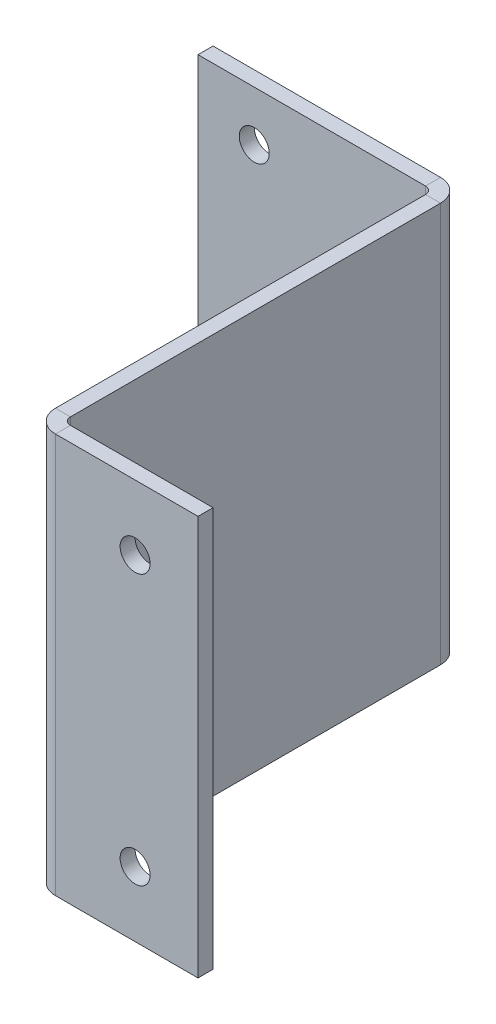
ISO-10303-21;
HEADER;
FILE_DESCRIPTION(('STEP AP214'),'2;1');
FILE_NAME('part.step','',(''),(''),'','','');
FILE_SCHEMA(('AUTOMOTIVE_DESIGN { 1 0 10303 214 1 1 1 1 }'));
ENDSEC;
DATA;
#1=APPLICATION_CONTEXT('core data for automotive mechanical design processes');
#2=APPLICATION_PROTOCOL_DEFINITION('international standard','automotive_design',2000,#1);
#3=PRODUCT_CONTEXT('',#1,'mechanical');
#4=PRODUCT('Part','Part','',(#3));
#5=PRODUCT_RELATED_PRODUCT_CATEGORY('part','',(#4));
#6=PRODUCT_DEFINITION_FORMATION('','',#4);
#7=PRODUCT_DEFINITION_CONTEXT('part definition',#1,'design');
#8=PRODUCT_DEFINITION('design','',#6,#7);
#9=PRODUCT_DEFINITION_SHAPE('','',#8);
#10=(LENGTH_UNIT() NAMED_UNIT(*) SI_UNIT(.MILLI.,.METRE.));
#11=(NAMED_UNIT(*) PLANE_ANGLE_UNIT() SI_UNIT($,.RADIAN.));
#12=(NAMED_UNIT(*) SI_UNIT($,.STERADIAN.) SOLID_ANGLE_UNIT());
#13=UNCERTAINTY_MEASURE_WITH_UNIT(LENGTH_MEASURE(1.E-05),#10,'distance_accuracy_value','');
#14=(GEOMETRIC_REPRESENTATION_CONTEXT(3) GLOBAL_UNCERTAINTY_ASSIGNED_CONTEXT((#13)) GLOBAL_UNIT_ASSIGNED_CONTEXT((#10,
#11,#12)) REPRESENTATION_CONTEXT('',''));
#15=CARTESIAN_POINT('',(0.,0.,0.));
#16=DIRECTION('',(0.,0.,1.));
#17=DIRECTION('',(1.,0.,0.));
#18=AXIS2_PLACEMENT_3D('',#15,#16,#17);
#19=CARTESIAN_POINT('',(25.,40.,2.2366));
#20=DIRECTION('',(0.,1.,0.));
#21=DIRECTION('',(0.,0.,1.));
#22=AXIS2_PLACEMENT_3D('',#19,#20,#21);
#23=PLANE('',#22);
#24=DIRECTION('',(-1.,0.,0.));
#25=VECTOR('',#24,1.);
#26=CARTESIAN_POINT('',(25.,40.,2.2366));
#27=LINE('',#26,#25);
#28=CARTESIAN_POINT('',(25.,40.,2.2366));
#29=VERTEX_POINT('',#28);
#30=CARTESIAN_POINT('',(23.5,40.,2.2366));
#31=VERTEX_POINT('',#30);
#32=EDGE_CURVE('E11',#29,#31,#27,.T.);
#33=ORIENTED_EDGE('',*,*,#32,.F.);
#34=CARTESIAN_POINT('',(22.7634,40.,2.2366));
#35=DIRECTION('',(0.,1.,0.));
#36=DIRECTION('',(0.,0.,1.));
#37=AXIS2_PLACEMENT_3D('',#34,#35,#36);
#38=CIRCLE('',#37,2.2366);
#39=CARTESIAN_POINT('',(22.7634,40.,0.));
#40=VERTEX_POINT('',#39);
#41=EDGE_CURVE('E248',#40,#29,#38,.F.);
#42=ORIENTED_EDGE('',*,*,#41,.F.);
#43=DIRECTION('',(0.,0.,-1.));
#44=VECTOR('',#43,1.);
#45=CARTESIAN_POINT('',(22.7634,40.,1.5));
#46=LINE('',#45,#44);
#47=CARTESIAN_POINT('',(22.7634,40.,1.5));
#48=VERTEX_POINT('',#47);
#49=EDGE_CURVE('E45',#48,#40,#46,.T.);
#50=ORIENTED_EDGE('',*,*,#49,.F.);
#51=CARTESIAN_POINT('',(22.7634,40.,2.2366));
#52=DIRECTION('',(0.,1.,0.));
#53=DIRECTION('',(1.,0.,0.));
#54=AXIS2_PLACEMENT_3D('',#51,#52,#53);
#55=CIRCLE('',#54,0.7366);
#56=EDGE_CURVE('E146',#48,#31,#55,.F.);
#57=ORIENTED_EDGE('',*,*,#56,.T.);
#58=EDGE_LOOP('',(#33,#42,#50,#57));
#59=FACE_BOUND('',#58,.T.);
#60=ADVANCED_FACE('F37',(#59),#23,.T.);
#61=CARTESIAN_POINT('',(22.7634,40.,1.5));
#62=DIRECTION('',(0.,1.,0.));
#63=DIRECTION('',(0.,0.,1.));
#64=AXIS2_PLACEMENT_3D('',#61,#62,#63);
#65=PLANE('',#64);
#66=DIRECTION('',(0.,0.,1.));
#67=VECTOR('',#66,1.);
#68=CARTESIAN_POINT('',(25.,40.,0.));
#69=LINE('',#68,#67);
#70=CARTESIAN_POINT('',(25.,40.,39.2634));
#71=VERTEX_POINT('',#70);
#72=EDGE_CURVE('E140',#29,#71,#69,.T.);
#73=ORIENTED_EDGE('',*,*,#72,.F.);
#74=ORIENTED_EDGE('',*,*,#32,.T.);
#75=DIRECTION('',(0.,0.,1.));
#76=VECTOR('',#75,1.);
#77=CARTESIAN_POINT('',(23.5,40.,0.));
#78=LINE('',#77,#76);
#79=CARTESIAN_POINT('',(23.5,40.,39.2634));
#80=VERTEX_POINT('',#79);
#81=EDGE_CURVE('E137',#31,#80,#78,.T.);
#82=ORIENTED_EDGE('',*,*,#81,.T.);
#83=DIRECTION('',(1.,0.,0.));
#84=VECTOR('',#83,1.);
#85=CARTESIAN_POINT('',(23.5,40.,39.2634));
#86=LINE('',#85,#84);
#87=EDGE_CURVE('E229',#80,#71,#86,.T.);
#88=ORIENTED_EDGE('',*,*,#87,.T.);
#89=EDGE_LOOP('',(#73,#74,#82,#88));
#90=FACE_BOUND('',#89,.T.);
#91=ADVANCED_FACE('F135',(#90),#65,.T.);
#92=CARTESIAN_POINT('',(22.7634,0.,0.));
#93=DIRECTION('',(0.,-1.,0.));
#94=DIRECTION('',(0.,0.,-1.));
#95=AXIS2_PLACEMENT_3D('',#92,#93,#94);
#96=PLANE('',#95);
#97=DIRECTION('',(0.,0.,1.));
#98=VECTOR('',#97,1.);
#99=CARTESIAN_POINT('',(22.7634,0.,0.));
#100=LINE('',#99,#98);
#101=CARTESIAN_POINT('',(22.7634,0.,0.));
#102=VERTEX_POINT('',#101);
#103=CARTESIAN_POINT('',(22.7634,0.,1.5));
#104=VERTEX_POINT('',#103);
#105=EDGE_CURVE('E234',#102,#104,#100,.T.);
#106=ORIENTED_EDGE('',*,*,#105,.F.);
#107=CARTESIAN_POINT('',(22.7634,0.,2.2366));
#108=DIRECTION('',(0.,1.,0.));
#109=DIRECTION('',(0.,0.,1.));
#110=AXIS2_PLACEMENT_3D('',#107,#108,#109);
#111=CIRCLE('',#110,2.2366);
#112=CARTESIAN_POINT('',(25.,0.,2.2366));
#113=VERTEX_POINT('',#112);
#114=EDGE_CURVE('E186',#102,#113,#111,.F.);
#115=ORIENTED_EDGE('',*,*,#114,.T.);
#116=DIRECTION('',(1.,0.,0.));
#117=VECTOR('',#116,1.);
#118=CARTESIAN_POINT('',(23.5,0.,2.2366));
#119=LINE('',#118,#117);
#120=CARTESIAN_POINT('',(23.5,0.,2.2366));
#121=VERTEX_POINT('',#120);
#122=EDGE_CURVE('E232',#121,#113,#119,.T.);
#123=ORIENTED_EDGE('',*,*,#122,.F.);
#124=CARTESIAN_POINT('',(22.7634,0.,2.2366));
#125=DIRECTION('',(0.,1.,0.));
#126=DIRECTION('',(1.,0.,0.));
#127=AXIS2_PLACEMENT_3D('',#124,#125,#126);
#128=CIRCLE('',#127,0.7366);
#129=EDGE_CURVE('E158',#104,#121,#128,.F.);
#130=ORIENTED_EDGE('',*,*,#129,.F.);
#131=EDGE_LOOP('',(#106,#115,#123,#130));
#132=FACE_BOUND('',#131,.T.);
#133=ADVANCED_FACE('F328',(#132),#96,.T.);
#134=CARTESIAN_POINT('',(23.5,0.,2.2366));
#135=DIRECTION('',(0.,-1.,0.));
#136=DIRECTION('',(0.,0.,-1.));
#137=AXIS2_PLACEMENT_3D('',#134,#135,#136);
#138=PLANE('',#137);
#139=DIRECTION('',(1.,0.,0.));
#140=VECTOR('',#139,1.);
#141=CARTESIAN_POINT('',(0.,0.,0.));
#142=LINE('',#141,#140);
#143=CARTESIAN_POINT('',(0.,0.,0.));
#144=VERTEX_POINT('',#143);
#145=EDGE_CURVE('E189',#144,#102,#142,.T.);
#146=ORIENTED_EDGE('',*,*,#145,.T.);
#147=ORIENTED_EDGE('',*,*,#105,.T.);
#148=DIRECTION('',(1.,0.,0.));
#149=VECTOR('',#148,1.);
#150=CARTESIAN_POINT('',(0.,0.,1.5));
#151=LINE('',#150,#149);
#152=CARTESIAN_POINT('',(0.,0.,1.5));
#153=VERTEX_POINT('',#152);
#154=EDGE_CURVE('E195',#153,#104,#151,.T.);
#155=ORIENTED_EDGE('',*,*,#154,.F.);
#156=DIRECTION('',(0.,0.,-1.));
#157=VECTOR('',#156,1.);
#158=CARTESIAN_POINT('',(0.,0.,1.5));
#159=LINE('',#158,#157);
#160=EDGE_CURVE('E192',#153,#144,#159,.T.);
#161=ORIENTED_EDGE('',*,*,#160,.T.);
#162=EDGE_LOOP('',(#146,#147,#155,#161));
#163=FACE_BOUND('',#162,.T.);
#164=ADVANCED_FACE('F332',(#163),#138,.T.);
#165=CARTESIAN_POINT('',(25.7366,40.,40.));
#166=DIRECTION('',(0.,1.,0.));
#167=DIRECTION('',(0.,0.,1.));
#168=AXIS2_PLACEMENT_3D('',#165,#166,#167);
#169=PLANE('',#168);
#170=DIRECTION('',(0.,0.,1.));
#171=VECTOR('',#170,1.);
#172=CARTESIAN_POINT('',(25.7366,40.,40.));
#173=LINE('',#172,#171);
#174=CARTESIAN_POINT('',(25.7366,40.,40.));
#175=VERTEX_POINT('',#174);
#176=CARTESIAN_POINT('',(25.7366,40.,41.5));
#177=VERTEX_POINT('',#176);
#178=EDGE_CURVE('E53',#175,#177,#173,.T.);
#179=ORIENTED_EDGE('',*,*,#178,.F.);
#180=CARTESIAN_POINT('',(25.7366,40.,39.2634));
#181=DIRECTION('',(0.,-1.,0.));
#182=DIRECTION('',(0.,0.,-1.));
#183=AXIS2_PLACEMENT_3D('',#180,#181,#182);
#184=CIRCLE('',#183,0.7366);
#185=EDGE_CURVE('E258',#71,#175,#184,.F.);
#186=ORIENTED_EDGE('',*,*,#185,.F.);
#187=ORIENTED_EDGE('',*,*,#87,.F.);
#188=CARTESIAN_POINT('',(25.7366,40.,39.2634));
#189=DIRECTION('',(0.,1.,0.));
#190=DIRECTION('',(1.,0.,0.));
#191=AXIS2_PLACEMENT_3D('',#188,#189,#190);
#192=CIRCLE('',#191,2.2366);
#193=EDGE_CURVE('E166',#80,#177,#192,.T.);
#194=ORIENTED_EDGE('',*,*,#193,.T.);
#195=EDGE_LOOP('',(#179,#186,#187,#194));
#196=FACE_BOUND('',#195,.T.);
#197=ADVANCED_FACE('F338',(#196),#169,.T.);
#198=CARTESIAN_POINT('',(23.5,40.,39.2634));
#199=DIRECTION('',(0.,1.,0.));
#200=DIRECTION('',(0.,0.,1.));
#201=AXIS2_PLACEMENT_3D('',#198,#199,#200);
#202=PLANE('',#201);
#203=DIRECTION('',(1.,0.,0.));
#204=VECTOR('',#203,1.);
#205=CARTESIAN_POINT('',(25.,40.,40.));
#206=LINE('',#205,#204);
#207=CARTESIAN_POINT('',(40.,40.,40.));
#208=VERTEX_POINT('',#207);
#209=EDGE_CURVE('E261',#175,#208,#206,.T.);
#210=ORIENTED_EDGE('',*,*,#209,.F.);
#211=ORIENTED_EDGE('',*,*,#178,.T.);
#212=DIRECTION('',(1.,0.,0.));
#213=VECTOR('',#212,1.);
#214=CARTESIAN_POINT('',(25.,40.,41.5));
#215=LINE('',#214,#213);
#216=CARTESIAN_POINT('',(40.,40.,41.5));
#217=VERTEX_POINT('',#216);
#218=EDGE_CURVE('E107',#177,#217,#215,.T.);
#219=ORIENTED_EDGE('',*,*,#218,.T.);
#220=DIRECTION('',(0.,0.,1.));
#221=VECTOR('',#220,1.);
#222=CARTESIAN_POINT('',(40.,40.,40.));
#223=LINE('',#222,#221);
#224=EDGE_CURVE('E264',#208,#217,#223,.T.);
#225=ORIENTED_EDGE('',*,*,#224,.F.);
#226=EDGE_LOOP('',(#210,#211,#219,#225));
#227=FACE_BOUND('',#226,.T.);
#228=ADVANCED_FACE('F342',(#227),#202,.T.);
#229=CARTESIAN_POINT('',(25.,0.,39.2634));
#230=DIRECTION('',(0.,-1.,0.));
#231=DIRECTION('',(0.,0.,-1.));
#232=AXIS2_PLACEMENT_3D('',#229,#230,#231);
#233=PLANE('',#232);
#234=DIRECTION('',(-1.,0.,0.));
#235=VECTOR('',#234,1.);
#236=CARTESIAN_POINT('',(25.,0.,39.2634));
#237=LINE('',#236,#235);
#238=CARTESIAN_POINT('',(25.,0.,39.2634));
#239=VERTEX_POINT('',#238);
#240=CARTESIAN_POINT('',(23.5,0.,39.2634));
#241=VERTEX_POINT('',#240);
#242=EDGE_CURVE('E94',#239,#241,#237,.T.);
#243=ORIENTED_EDGE('',*,*,#242,.F.);
#244=CARTESIAN_POINT('',(25.7366,0.,39.2634));
#245=DIRECTION('',(0.,-1.,0.));
#246=DIRECTION('',(0.,0.,-1.));
#247=AXIS2_PLACEMENT_3D('',#244,#245,#246);
#248=CIRCLE('',#247,0.7366);
#249=CARTESIAN_POINT('',(25.7366,0.,40.));
#250=VERTEX_POINT('',#249);
#251=EDGE_CURVE('E182',#239,#250,#248,.F.);
#252=ORIENTED_EDGE('',*,*,#251,.T.);
#253=DIRECTION('',(0.,0.,-1.));
#254=VECTOR('',#253,1.);
#255=CARTESIAN_POINT('',(25.7366,0.,41.5));
#256=LINE('',#255,#254);
#257=CARTESIAN_POINT('',(25.7366,0.,41.5));
#258=VERTEX_POINT('',#257);
#259=EDGE_CURVE('E101',#258,#250,#256,.T.);
#260=ORIENTED_EDGE('',*,*,#259,.F.);
#261=CARTESIAN_POINT('',(25.7366,0.,39.2634));
#262=DIRECTION('',(0.,1.,0.));
#263=DIRECTION('',(1.,0.,0.));
#264=AXIS2_PLACEMENT_3D('',#261,#262,#263);
#265=CIRCLE('',#264,2.2366);
#266=EDGE_CURVE('E201',#241,#258,#265,.T.);
#267=ORIENTED_EDGE('',*,*,#266,.F.);
#268=EDGE_LOOP('',(#243,#252,#260,#267));
#269=FACE_BOUND('',#268,.T.);
#270=ADVANCED_FACE('F346',(#269),#233,.T.);
#271=CARTESIAN_POINT('',(25.7366,0.,41.5));
#272=DIRECTION('',(0.,-1.,0.));
#273=DIRECTION('',(0.,0.,-1.));
#274=AXIS2_PLACEMENT_3D('',#271,#272,#273);
#275=PLANE('',#274);
#276=DIRECTION('',(0.,0.,1.));
#277=VECTOR('',#276,1.);
#278=CARTESIAN_POINT('',(25.,0.,0.));
#279=LINE('',#278,#277);
#280=EDGE_CURVE('E184',#113,#239,#279,.T.);
#281=ORIENTED_EDGE('',*,*,#280,.T.);
#282=ORIENTED_EDGE('',*,*,#242,.T.);
#283=DIRECTION('',(0.,0.,1.));
#284=VECTOR('',#283,1.);
#285=CARTESIAN_POINT('',(23.5,0.,0.));
#286=LINE('',#285,#284);
#287=EDGE_CURVE('E199',#121,#241,#286,.T.);
#288=ORIENTED_EDGE('',*,*,#287,.F.);
#289=ORIENTED_EDGE('',*,*,#122,.T.);
#290=EDGE_LOOP('',(#281,#282,#288,#289));
#291=FACE_BOUND('',#290,.T.);
#292=ADVANCED_FACE('F349',(#291),#275,.T.);
#293=CARTESIAN_POINT('',(25.,40.,41.5));
#294=DIRECTION('',(0.,0.,-1.));
#295=DIRECTION('',(-1.,0.,0.));
#296=AXIS2_PLACEMENT_3D('',#293,#294,#295);
#297=PLANE('',#296);
#298=CARTESIAN_POINT('',(33.7057529278582,33.5,41.5));
#299=DIRECTION('',(0.,0.,-1.));
#300=DIRECTION('',(-1.,0.,0.));
#301=AXIS2_PLACEMENT_3D('',#298,#299,#300);
#302=CIRCLE('',#301,1.49999999999999);
#303=CARTESIAN_POINT('',(32.2057529278582,33.5,41.5));
#304=VERTEX_POINT('',#303);
#305=EDGE_CURVE('E273',#304,#304,#302,.T.);
#306=ORIENTED_EDGE('',*,*,#305,.T.);
#307=EDGE_LOOP('',(#306));
#308=FACE_BOUND('',#307,.T.);
#309=CARTESIAN_POINT('',(33.7057529278581,6.5,41.5));
#310=DIRECTION('',(0.,0.,-1.));
#311=DIRECTION('',(-1.,0.,0.));
#312=AXIS2_PLACEMENT_3D('',#309,#310,#311);
#313=CIRCLE('',#312,1.49999999999999);
#314=CARTESIAN_POINT('',(32.2057529278581,6.5,41.5));
#315=VERTEX_POINT('',#314);
#316=EDGE_CURVE('E176',#315,#315,#313,.T.);
#317=ORIENTED_EDGE('',*,*,#316,.T.);
#318=EDGE_LOOP('',(#317));
#319=FACE_BOUND('',#318,.T.);
#320=DIRECTION('',(1.,0.,0.));
#321=VECTOR('',#320,1.);
#322=CARTESIAN_POINT('',(25.,0.,41.5));
#323=LINE('',#322,#321);
#324=CARTESIAN_POINT('',(40.,0.,41.5));
#325=VERTEX_POINT('',#324);
#326=EDGE_CURVE('E172',#258,#325,#323,.T.);
#327=ORIENTED_EDGE('',*,*,#326,.T.);
#328=DIRECTION('',(0.,-1.,0.));
#329=VECTOR('',#328,1.);
#330=CARTESIAN_POINT('',(40.,40.,41.5));
#331=LINE('',#330,#329);
#332=EDGE_CURVE('E225',#217,#325,#331,.T.);
#333=ORIENTED_EDGE('',*,*,#332,.F.);
#334=ORIENTED_EDGE('',*,*,#218,.F.);
#335=DIRECTION('',(0.,-1.,0.));
#336=VECTOR('',#335,1.);
#337=CARTESIAN_POINT('',(25.7366,40.,41.5));
#338=LINE('',#337,#336);
#339=EDGE_CURVE('E168',#177,#258,#338,.T.);
#340=ORIENTED_EDGE('',*,*,#339,.T.);
#341=EDGE_LOOP('',(#327,#333,#334,#340));
#342=FACE_BOUND('',#341,.T.);
#343=ADVANCED_FACE('F352',(#308,#319,#342),#297,.F.);
#344=CARTESIAN_POINT('',(40.,40.,40.));
#345=DIRECTION('',(1.,0.,0.));
#346=DIRECTION('',(0.,0.,-1.));
#347=AXIS2_PLACEMENT_3D('',#344,#345,#346);
#348=PLANE('',#347);
#349=DIRECTION('',(0.,0.,1.));
#350=VECTOR('',#349,1.);
#351=CARTESIAN_POINT('',(40.,0.,40.));
#352=LINE('',#351,#350);
#353=CARTESIAN_POINT('',(40.,0.,40.));
#354=VERTEX_POINT('',#353);
#355=EDGE_CURVE('E175',#354,#325,#352,.T.);
#356=ORIENTED_EDGE('',*,*,#355,.F.);
#357=DIRECTION('',(0.,-1.,0.));
#358=VECTOR('',#357,1.);
#359=CARTESIAN_POINT('',(40.,40.,40.));
#360=LINE('',#359,#358);
#361=EDGE_CURVE('E223',#208,#354,#360,.T.);
#362=ORIENTED_EDGE('',*,*,#361,.F.);
#363=ORIENTED_EDGE('',*,*,#224,.T.);
#364=ORIENTED_EDGE('',*,*,#332,.T.);
#365=EDGE_LOOP('',(#356,#362,#363,#364));
#366=FACE_BOUND('',#365,.T.);
#367=ADVANCED_FACE('F355',(#366),#348,.T.);
#368=CARTESIAN_POINT('',(25.,40.,40.));
#369=DIRECTION('',(0.,0.,-1.));
#370=DIRECTION('',(-1.,0.,0.));
#371=AXIS2_PLACEMENT_3D('',#368,#369,#370);
#372=PLANE('',#371);
#373=CARTESIAN_POINT('',(33.7057529278582,33.5,40.));
#374=DIRECTION('',(0.,0.,-1.));
#375=DIRECTION('',(-1.,0.,0.));
#376=AXIS2_PLACEMENT_3D('',#373,#374,#375);
#377=CIRCLE('',#376,1.49999999999999);
#378=CARTESIAN_POINT('',(32.2057529278582,33.5,40.));
#379=VERTEX_POINT('',#378);
#380=EDGE_CURVE('E276',#379,#379,#377,.T.);
#381=ORIENTED_EDGE('',*,*,#380,.F.);
#382=EDGE_LOOP('',(#381));
#383=FACE_BOUND('',#382,.T.);
#384=CARTESIAN_POINT('',(33.7057529278581,6.5,40.));
#385=DIRECTION('',(0.,0.,-1.));
#386=DIRECTION('',(-1.,0.,0.));
#387=AXIS2_PLACEMENT_3D('',#384,#385,#386);
#388=CIRCLE('',#387,1.49999999999999);
#389=CARTESIAN_POINT('',(32.2057529278582,6.5,40.));
#390=VERTEX_POINT('',#389);
#391=EDGE_CURVE('E270',#390,#390,#388,.T.);
#392=ORIENTED_EDGE('',*,*,#391,.F.);
#393=EDGE_LOOP('',(#392));
#394=FACE_BOUND('',#393,.T.);
#395=DIRECTION('',(1.,0.,0.));
#396=VECTOR('',#395,1.);
#397=CARTESIAN_POINT('',(25.,0.,40.));
#398=LINE('',#397,#396);
#399=EDGE_CURVE('E179',#250,#354,#398,.T.);
#400=ORIENTED_EDGE('',*,*,#399,.F.);
#401=DIRECTION('',(0.,-1.,0.));
#402=VECTOR('',#401,1.);
#403=CARTESIAN_POINT('',(25.7366,40.,40.));
#404=LINE('',#403,#402);
#405=EDGE_CURVE('E220',#175,#250,#404,.T.);
#406=ORIENTED_EDGE('',*,*,#405,.F.);
#407=ORIENTED_EDGE('',*,*,#209,.T.);
#408=ORIENTED_EDGE('',*,*,#361,.T.);
#409=EDGE_LOOP('',(#400,#406,#407,#408));
#410=FACE_BOUND('',#409,.T.);
#411=ADVANCED_FACE('F359',(#383,#394,#410),#372,.T.);
#412=CARTESIAN_POINT('',(25.7366,40.,39.2634));
#413=DIRECTION('',(0.,-1.,0.));
#414=DIRECTION('',(0.,0.,-1.));
#415=AXIS2_PLACEMENT_3D('',#412,#413,#414);
#416=CYLINDRICAL_SURFACE('',#415,0.7366);
#417=ORIENTED_EDGE('',*,*,#251,.F.);
#418=DIRECTION('',(0.,-1.,0.));
#419=VECTOR('',#418,1.);
#420=CARTESIAN_POINT('',(25.,40.,39.2634));
#421=LINE('',#420,#419);
#422=EDGE_CURVE('E217',#71,#239,#421,.T.);
#423=ORIENTED_EDGE('',*,*,#422,.F.);
#424=ORIENTED_EDGE('',*,*,#185,.T.);
#425=ORIENTED_EDGE('',*,*,#405,.T.);
#426=EDGE_LOOP('',(#417,#423,#424,#425));
#427=FACE_BOUND('',#426,.T.);
#428=ADVANCED_FACE('F363',(#427),#416,.F.);
#429=CARTESIAN_POINT('',(25.,40.,0.));
#430=DIRECTION('',(1.,0.,0.));
#431=DIRECTION('',(0.,0.,-1.));
#432=AXIS2_PLACEMENT_3D('',#429,#430,#431);
#433=PLANE('',#432);
#434=ORIENTED_EDGE('',*,*,#280,.F.);
#435=DIRECTION('',(0.,-1.,0.));
#436=VECTOR('',#435,1.);
#437=CARTESIAN_POINT('',(25.,40.,2.2366));
#438=LINE('',#437,#436);
#439=EDGE_CURVE('E214',#29,#113,#438,.T.);
#440=ORIENTED_EDGE('',*,*,#439,.F.);
#441=ORIENTED_EDGE('',*,*,#72,.T.);
#442=ORIENTED_EDGE('',*,*,#422,.T.);
#443=EDGE_LOOP('',(#434,#440,#441,#442));
#444=FACE_BOUND('',#443,.T.);
#445=ADVANCED_FACE('F367',(#444),#433,.T.);
#446=CARTESIAN_POINT('',(22.7634,40.,2.2366));
#447=DIRECTION('',(0.,-1.,0.));
#448=DIRECTION('',(0.,0.,-1.));
#449=AXIS2_PLACEMENT_3D('',#446,#447,#448);
#450=CYLINDRICAL_SURFACE('',#449,2.2366);
#451=ORIENTED_EDGE('',*,*,#114,.F.);
#452=DIRECTION('',(0.,-1.,0.));
#453=VECTOR('',#452,1.);
#454=CARTESIAN_POINT('',(22.7634,40.,0.));
#455=LINE('',#454,#453);
#456=EDGE_CURVE('E211',#40,#102,#455,.T.);
#457=ORIENTED_EDGE('',*,*,#456,.F.);
#458=ORIENTED_EDGE('',*,*,#41,.T.);
#459=ORIENTED_EDGE('',*,*,#439,.T.);
#460=EDGE_LOOP('',(#451,#457,#458,#459));
#461=FACE_BOUND('',#460,.T.);
#462=ADVANCED_FACE('F247',(#461),#450,.T.);
#463=CARTESIAN_POINT('',(0.,40.,0.));
#464=DIRECTION('',(0.,0.,-1.));
#465=DIRECTION('',(-1.,0.,0.));
#466=AXIS2_PLACEMENT_3D('',#463,#464,#465);
#467=PLANE('',#466);
#468=CARTESIAN_POINT('',(5.62673328570007,35.,0.));
#469=DIRECTION('',(0.,0.,-1.));
#470=DIRECTION('',(-1.,0.,0.));
#471=AXIS2_PLACEMENT_3D('',#468,#469,#470);
#472=CIRCLE('',#471,1.49999999999999);
#473=CARTESIAN_POINT('',(4.12673328570008,35.,0.));
#474=VERTEX_POINT('',#473);
#475=EDGE_CURVE('E294',#474,#474,#472,.T.);
#476=ORIENTED_EDGE('',*,*,#475,.F.);
#477=EDGE_LOOP('',(#476));
#478=FACE_BOUND('',#477,.T.);
#479=CARTESIAN_POINT('',(5.62673328570007,5.,0.));
#480=DIRECTION('',(0.,0.,-1.));
#481=DIRECTION('',(-1.,0.,0.));
#482=AXIS2_PLACEMENT_3D('',#479,#480,#481);
#483=CIRCLE('',#482,1.49999999999999);
#484=CARTESIAN_POINT('',(4.12673328570008,5.,0.));
#485=VERTEX_POINT('',#484);
#486=EDGE_CURVE('E288',#485,#485,#483,.T.);
#487=ORIENTED_EDGE('',*,*,#486,.F.);
#488=EDGE_LOOP('',(#487));
#489=FACE_BOUND('',#488,.T.);
#490=CARTESIAN_POINT('',(5.62673328570007,20.,0.));
#491=DIRECTION('',(0.,0.,-1.));
#492=DIRECTION('',(-1.,0.,0.));
#493=AXIS2_PLACEMENT_3D('',#490,#491,#492);
#494=CIRCLE('',#493,1.49999999999999);
#495=CARTESIAN_POINT('',(4.12673328570008,20.,0.));
#496=VERTEX_POINT('',#495);
#497=EDGE_CURVE('E282',#496,#496,#494,.T.);
#498=ORIENTED_EDGE('',*,*,#497,.F.);
#499=EDGE_LOOP('',(#498));
#500=FACE_BOUND('',#499,.T.);
#501=ORIENTED_EDGE('',*,*,#145,.F.);
#502=DIRECTION('',(0.,-1.,0.));
#503=VECTOR('',#502,1.);
#504=CARTESIAN_POINT('',(0.,40.,0.));
#505=LINE('',#504,#503);
#506=CARTESIAN_POINT('',(0.,40.,0.));
#507=VERTEX_POINT('',#506);
#508=EDGE_CURVE('E209',#507,#144,#505,.T.);
#509=ORIENTED_EDGE('',*,*,#508,.F.);
#510=DIRECTION('',(1.,0.,0.));
#511=VECTOR('',#510,1.);
#512=CARTESIAN_POINT('',(0.,40.,0.));
#513=LINE('',#512,#511);
#514=EDGE_CURVE('E241',#507,#40,#513,.T.);
#515=ORIENTED_EDGE('',*,*,#514,.T.);
#516=ORIENTED_EDGE('',*,*,#456,.T.);
#517=EDGE_LOOP('',(#501,#509,#515,#516));
#518=FACE_BOUND('',#517,.T.);
#519=ADVANCED_FACE('F252',(#478,#489,#500,#518),#467,.T.);
#520=CARTESIAN_POINT('',(0.,40.,1.5));
#521=DIRECTION('',(-1.,0.,0.));
#522=DIRECTION('',(0.,0.,1.));
#523=AXIS2_PLACEMENT_3D('',#520,#521,#522);
#524=PLANE('',#523);
#525=ORIENTED_EDGE('',*,*,#160,.F.);
#526=DIRECTION('',(0.,-1.,0.));
#527=VECTOR('',#526,1.);
#528=CARTESIAN_POINT('',(0.,40.,1.5));
#529=LINE('',#528,#527);
#530=CARTESIAN_POINT('',(0.,40.,1.5));
#531=VERTEX_POINT('',#530);
#532=EDGE_CURVE('E207',#531,#153,#529,.T.);
#533=ORIENTED_EDGE('',*,*,#532,.F.);
#534=DIRECTION('',(0.,0.,-1.));
#535=VECTOR('',#534,1.);
#536=CARTESIAN_POINT('',(0.,40.,1.5));
#537=LINE('',#536,#535);
#538=EDGE_CURVE('E253',#531,#507,#537,.T.);
#539=ORIENTED_EDGE('',*,*,#538,.T.);
#540=ORIENTED_EDGE('',*,*,#508,.T.);
#541=EDGE_LOOP('',(#525,#533,#539,#540));
#542=FACE_BOUND('',#541,.T.);
#543=ADVANCED_FACE('F302',(#542),#524,.T.);
#544=CARTESIAN_POINT('',(0.,40.,1.5));
#545=DIRECTION('',(0.,0.,-1.));
#546=DIRECTION('',(-1.,0.,0.));
#547=AXIS2_PLACEMENT_3D('',#544,#545,#546);
#548=PLANE('',#547);
#549=CARTESIAN_POINT('',(5.62673328570007,35.,1.5));
#550=DIRECTION('',(0.,0.,-1.));
#551=DIRECTION('',(-1.,0.,0.));
#552=AXIS2_PLACEMENT_3D('',#549,#550,#551);
#553=CIRCLE('',#552,1.49999999999999);
#554=CARTESIAN_POINT('',(4.12673328570008,35.,1.5));
#555=VERTEX_POINT('',#554);
#556=EDGE_CURVE('E291',#555,#555,#553,.T.);
#557=ORIENTED_EDGE('',*,*,#556,.T.);
#558=EDGE_LOOP('',(#557));
#559=FACE_BOUND('',#558,.T.);
#560=CARTESIAN_POINT('',(5.62673328570007,5.,1.5));
#561=DIRECTION('',(0.,0.,-1.));
#562=DIRECTION('',(-1.,0.,0.));
#563=AXIS2_PLACEMENT_3D('',#560,#561,#562);
#564=CIRCLE('',#563,1.49999999999999);
#565=CARTESIAN_POINT('',(4.12673328570008,5.,1.5));
#566=VERTEX_POINT('',#565);
#567=EDGE_CURVE('E285',#566,#566,#564,.T.);
#568=ORIENTED_EDGE('',*,*,#567,.T.);
#569=EDGE_LOOP('',(#568));
#570=FACE_BOUND('',#569,.T.);
#571=CARTESIAN_POINT('',(5.62673328570007,20.,1.5));
#572=DIRECTION('',(0.,0.,-1.));
#573=DIRECTION('',(-1.,0.,0.));
#574=AXIS2_PLACEMENT_3D('',#571,#572,#573);
#575=CIRCLE('',#574,1.49999999999999);
#576=CARTESIAN_POINT('',(4.12673328570008,20.,1.5));
#577=VERTEX_POINT('',#576);
#578=EDGE_CURVE('E279',#577,#577,#575,.T.);
#579=ORIENTED_EDGE('',*,*,#578,.T.);
#580=EDGE_LOOP('',(#579));
#581=FACE_BOUND('',#580,.T.);
#582=ORIENTED_EDGE('',*,*,#154,.T.);
#583=DIRECTION('',(0.,-1.,0.));
#584=VECTOR('',#583,1.);
#585=CARTESIAN_POINT('',(22.7634,40.,1.5));
#586=LINE('',#585,#584);
#587=EDGE_CURVE('E160',#48,#104,#586,.T.);
#588=ORIENTED_EDGE('',*,*,#587,.F.);
#589=DIRECTION('',(1.,0.,0.));
#590=VECTOR('',#589,1.);
#591=CARTESIAN_POINT('',(0.,40.,1.5));
#592=LINE('',#591,#590);
#593=EDGE_CURVE('E151',#531,#48,#592,.T.);
#594=ORIENTED_EDGE('',*,*,#593,.F.);
#595=ORIENTED_EDGE('',*,*,#532,.T.);
#596=EDGE_LOOP('',(#582,#588,#594,#595));
#597=FACE_BOUND('',#596,.T.);
#598=ADVANCED_FACE('F376',(#559,#570,#581,#597),#548,.F.);
#599=CARTESIAN_POINT('',(22.7634,40.,2.2366));
#600=DIRECTION('',(0.,-1.,0.));
#601=DIRECTION('',(0.,0.,-1.));
#602=AXIS2_PLACEMENT_3D('',#599,#600,#601);
#603=CYLINDRICAL_SURFACE('',#602,0.7366);
#604=ORIENTED_EDGE('',*,*,#129,.T.);
#605=DIRECTION('',(0.,-1.,0.));
#606=VECTOR('',#605,1.);
#607=CARTESIAN_POINT('',(23.5,40.,2.2366));
#608=LINE('',#607,#606);
#609=EDGE_CURVE('E155',#31,#121,#608,.T.);
#610=ORIENTED_EDGE('',*,*,#609,.F.);
#611=ORIENTED_EDGE('',*,*,#56,.F.);
#612=ORIENTED_EDGE('',*,*,#587,.T.);
#613=EDGE_LOOP('',(#604,#610,#611,#612));
#614=FACE_BOUND('',#613,.T.);
#615=ADVANCED_FACE('F156',(#614),#603,.F.);
#616=CARTESIAN_POINT('',(23.5,40.,0.));
#617=DIRECTION('',(1.,0.,0.));
#618=DIRECTION('',(0.,0.,-1.));
#619=AXIS2_PLACEMENT_3D('',#616,#617,#618);
#620=PLANE('',#619);
#621=ORIENTED_EDGE('',*,*,#287,.T.);
#622=DIRECTION('',(0.,-1.,0.));
#623=VECTOR('',#622,1.);
#624=CARTESIAN_POINT('',(23.5,40.,39.2634));
#625=LINE('',#624,#623);
#626=EDGE_CURVE('E161',#80,#241,#625,.T.);
#627=ORIENTED_EDGE('',*,*,#626,.F.);
#628=ORIENTED_EDGE('',*,*,#81,.F.);
#629=ORIENTED_EDGE('',*,*,#609,.T.);
#630=EDGE_LOOP('',(#621,#627,#628,#629));
#631=FACE_BOUND('',#630,.T.);
#632=ADVANCED_FACE('F163',(#631),#620,.F.);
#633=CARTESIAN_POINT('',(25.7366,40.,39.2634));
#634=DIRECTION('',(0.,-1.,0.));
#635=DIRECTION('',(0.,0.,-1.));
#636=AXIS2_PLACEMENT_3D('',#633,#634,#635);
#637=CYLINDRICAL_SURFACE('',#636,2.2366);
#638=ORIENTED_EDGE('',*,*,#266,.T.);
#639=ORIENTED_EDGE('',*,*,#339,.F.);
#640=ORIENTED_EDGE('',*,*,#193,.F.);
#641=ORIENTED_EDGE('',*,*,#626,.T.);
#642=EDGE_LOOP('',(#638,#639,#640,#641));
#643=FACE_BOUND('',#642,.T.);
#644=ADVANCED_FACE('F385',(#643),#637,.T.);
#645=CARTESIAN_POINT('',(25.7366,40.,39.2634));
#646=DIRECTION('',(0.,-1.,0.));
#647=DIRECTION('',(-1.,0.,0.));
#648=AXIS2_PLACEMENT_3D('',#645,#646,#647);
#649=PLANE('',#648);
#650=ORIENTED_EDGE('',*,*,#593,.T.);
#651=ORIENTED_EDGE('',*,*,#49,.T.);
#652=ORIENTED_EDGE('',*,*,#514,.F.);
#653=ORIENTED_EDGE('',*,*,#538,.F.);
#654=EDGE_LOOP('',(#650,#651,#652,#653));
#655=FACE_BOUND('',#654,.T.);
#656=ADVANCED_FACE('F238',(#655),#649,.F.);
#657=CARTESIAN_POINT('',(25.7366,0.,39.2634));
#658=DIRECTION('',(0.,-1.,0.));
#659=DIRECTION('',(-1.,0.,0.));
#660=AXIS2_PLACEMENT_3D('',#657,#658,#659);
#661=PLANE('',#660);
#662=ORIENTED_EDGE('',*,*,#326,.F.);
#663=ORIENTED_EDGE('',*,*,#259,.T.);
#664=ORIENTED_EDGE('',*,*,#399,.T.);
#665=ORIENTED_EDGE('',*,*,#355,.T.);
#666=EDGE_LOOP('',(#662,#663,#664,#665));
#667=FACE_BOUND('',#666,.T.);
#668=ADVANCED_FACE('F389',(#667),#661,.T.);
#669=CARTESIAN_POINT('',(33.7057529278581,6.5,40.));
#670=DIRECTION('',(0.,0.,-1.));
#671=DIRECTION('',(-1.,0.,0.));
#672=AXIS2_PLACEMENT_3D('',#669,#670,#671);
#673=CYLINDRICAL_SURFACE('',#672,1.49999999999999);
#674=ORIENTED_EDGE('',*,*,#316,.F.);
#675=EDGE_LOOP('',(#674));
#676=FACE_BOUND('',#675,.T.);
#677=ORIENTED_EDGE('',*,*,#391,.T.);
#678=EDGE_LOOP('',(#677));
#679=FACE_BOUND('',#678,.T.);
#680=ADVANCED_FACE('F320',(#676,#679),#673,.F.);
#681=CARTESIAN_POINT('',(33.7057529278582,33.5,40.));
#682=DIRECTION('',(0.,0.,-1.));
#683=DIRECTION('',(-1.,0.,0.));
#684=AXIS2_PLACEMENT_3D('',#681,#682,#683);
#685=CYLINDRICAL_SURFACE('',#684,1.49999999999999);
#686=ORIENTED_EDGE('',*,*,#305,.F.);
#687=EDGE_LOOP('',(#686));
#688=FACE_BOUND('',#687,.T.);
#689=ORIENTED_EDGE('',*,*,#380,.T.);
#690=EDGE_LOOP('',(#689));
#691=FACE_BOUND('',#690,.T.);
#692=ADVANCED_FACE('F311',(#688,#691),#685,.F.);
#693=CARTESIAN_POINT('',(5.62673328570007,20.,0.));
#694=DIRECTION('',(0.,0.,-1.));
#695=DIRECTION('',(-1.,0.,0.));
#696=AXIS2_PLACEMENT_3D('',#693,#694,#695);
#697=CYLINDRICAL_SURFACE('',#696,1.49999999999999);
#698=ORIENTED_EDGE('',*,*,#578,.F.);
#699=EDGE_LOOP('',(#698));
#700=FACE_BOUND('',#699,.T.);
#701=ORIENTED_EDGE('',*,*,#497,.T.);
#702=EDGE_LOOP('',(#701));
#703=FACE_BOUND('',#702,.T.);
#704=ADVANCED_FACE('F308',(#700,#703),#697,.F.);
#705=CARTESIAN_POINT('',(5.62673328570007,5.,0.));
#706=DIRECTION('',(0.,0.,-1.));
#707=DIRECTION('',(-1.,0.,0.));
#708=AXIS2_PLACEMENT_3D('',#705,#706,#707);
#709=CYLINDRICAL_SURFACE('',#708,1.49999999999999);
#710=ORIENTED_EDGE('',*,*,#567,.F.);
#711=EDGE_LOOP('',(#710));
#712=FACE_BOUND('',#711,.T.);
#713=ORIENTED_EDGE('',*,*,#486,.T.);
#714=EDGE_LOOP('',(#713));
#715=FACE_BOUND('',#714,.T.);
#716=ADVANCED_FACE('F310',(#712,#715),#709,.F.);
#717=CARTESIAN_POINT('',(5.62673328570007,35.,0.));
#718=DIRECTION('',(0.,0.,-1.));
#719=DIRECTION('',(-1.,0.,0.));
#720=AXIS2_PLACEMENT_3D('',#717,#718,#719);
#721=CYLINDRICAL_SURFACE('',#720,1.49999999999999);
#722=ORIENTED_EDGE('',*,*,#556,.F.);
#723=EDGE_LOOP('',(#722));
#724=FACE_BOUND('',#723,.T.);
#725=ORIENTED_EDGE('',*,*,#475,.T.);
#726=EDGE_LOOP('',(#725));
#727=FACE_BOUND('',#726,.T.);
#728=ADVANCED_FACE('F298',(#724,#727),#721,.F.);
#729=CLOSED_SHELL('',(#60,#91,#133,#164,#197,#228,#270,#292,#343,#367,#411,#428,#445,#462,#519,
#543,#598,#615,#632,#644,#656,#668,#680,#692,#704,#716,#728));
#730=MANIFOLD_SOLID_BREP('B2',#729);
#731=ADVANCED_BREP_SHAPE_REPRESENTATION('',(#18,#730),#14);
#732=SHAPE_DEFINITION_REPRESENTATION(#9,#731);
ENDSEC;
END-ISO-10303-21;
